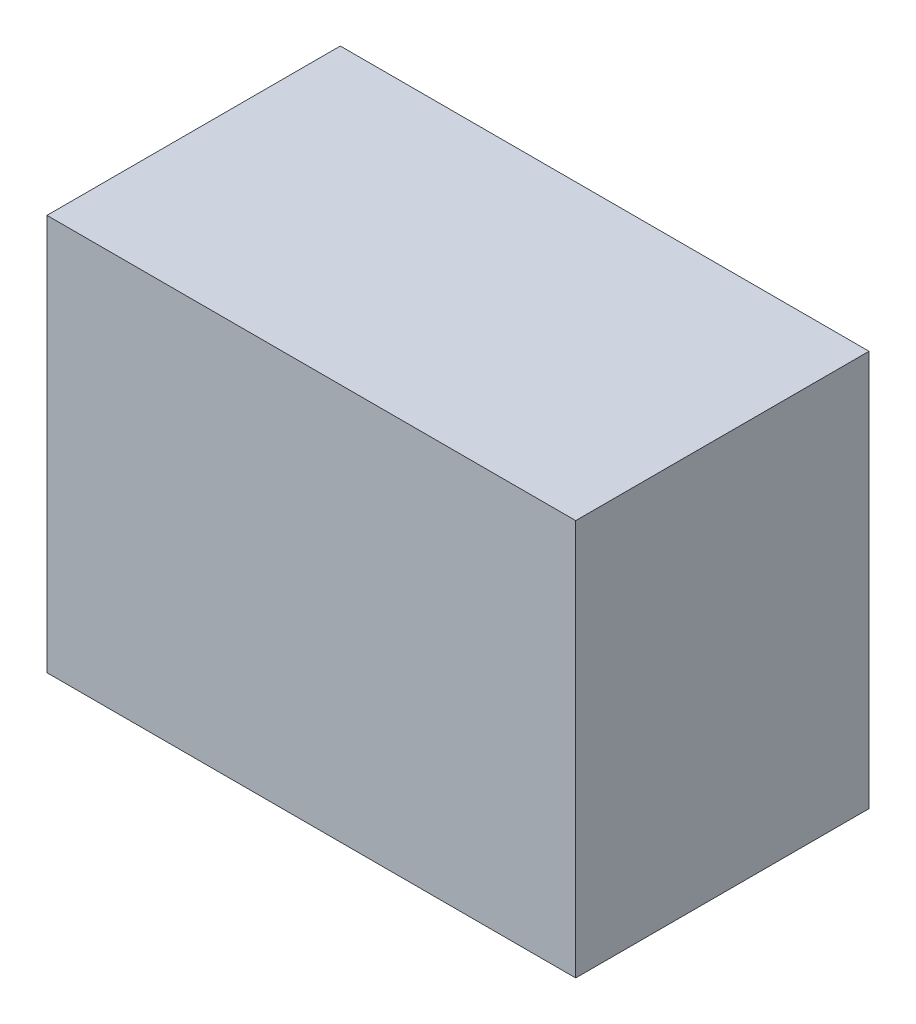
ISO-10303-21;
HEADER;
FILE_DESCRIPTION(('STEP AP214'),'2;1');
FILE_NAME('part.step','',(''),(''),'','','');
FILE_SCHEMA(('AUTOMOTIVE_DESIGN { 1 0 10303 214 1 1 1 1 }'));
ENDSEC;
DATA;
#1=APPLICATION_CONTEXT('core data for automotive mechanical design processes');
#2=APPLICATION_PROTOCOL_DEFINITION('international standard','automotive_design',2000,#1);
#3=PRODUCT_CONTEXT('',#1,'mechanical');
#4=PRODUCT('Part','Part','',(#3));
#5=PRODUCT_RELATED_PRODUCT_CATEGORY('part','',(#4));
#6=PRODUCT_DEFINITION_FORMATION('','',#4);
#7=PRODUCT_DEFINITION_CONTEXT('part definition',#1,'design');
#8=PRODUCT_DEFINITION('design','',#6,#7);
#9=PRODUCT_DEFINITION_SHAPE('','',#8);
#10=(LENGTH_UNIT() NAMED_UNIT(*) SI_UNIT(.MILLI.,.METRE.));
#11=(NAMED_UNIT(*) PLANE_ANGLE_UNIT() SI_UNIT($,.RADIAN.));
#12=(NAMED_UNIT(*) SI_UNIT($,.STERADIAN.) SOLID_ANGLE_UNIT());
#13=UNCERTAINTY_MEASURE_WITH_UNIT(LENGTH_MEASURE(1.E-05),#10,'distance_accuracy_value','');
#14=(GEOMETRIC_REPRESENTATION_CONTEXT(3) GLOBAL_UNCERTAINTY_ASSIGNED_CONTEXT((#13)) GLOBAL_UNIT_ASSIGNED_CONTEXT((#10,
#11,#12)) REPRESENTATION_CONTEXT('',''));
#15=CARTESIAN_POINT('',(0.,0.,0.));
#16=DIRECTION('',(0.,0.,1.));
#17=DIRECTION('',(1.,0.,0.));
#18=AXIS2_PLACEMENT_3D('',#15,#16,#17);
#19=CARTESIAN_POINT('',(-36.7813710524984,30.0638152614732,38.));
#20=DIRECTION('',(1.,0.,0.));
#21=DIRECTION('',(0.,0.,-1.));
#22=AXIS2_PLACEMENT_3D('',#19,#20,#21);
#23=PLANE('',#22);
#24=DIRECTION('',(0.,-1.,0.));
#25=VECTOR('',#24,1.);
#26=CARTESIAN_POINT('',(-36.7813710524984,30.0638152614732,0.));
#27=LINE('',#26,#25);
#28=CARTESIAN_POINT('',(-36.7813710524984,30.0638152614732,0.));
#29=VERTEX_POINT('',#28);
#30=CARTESIAN_POINT('',(-36.7813710524984,-21.2539060273419,0.));
#31=VERTEX_POINT('',#30);
#32=EDGE_CURVE('E105',#29,#31,#27,.T.);
#33=ORIENTED_EDGE('',*,*,#32,.T.);
#34=DIRECTION('',(0.,0.,-1.));
#35=VECTOR('',#34,1.);
#36=CARTESIAN_POINT('',(-36.7813710524984,-21.2539060273419,38.));
#37=LINE('',#36,#35);
#38=CARTESIAN_POINT('',(-36.7813710524984,-21.2539060273419,38.));
#39=VERTEX_POINT('',#38);
#40=EDGE_CURVE('E11',#39,#31,#37,.T.);
#41=ORIENTED_EDGE('',*,*,#40,.F.);
#42=DIRECTION('',(0.,-1.,0.));
#43=VECTOR('',#42,1.);
#44=CARTESIAN_POINT('',(-36.7813710524984,30.0638152614732,38.));
#45=LINE('',#44,#43);
#46=CARTESIAN_POINT('',(-36.7813710524984,30.0638152614732,38.));
#47=VERTEX_POINT('',#46);
#48=EDGE_CURVE('E89',#47,#39,#45,.T.);
#49=ORIENTED_EDGE('',*,*,#48,.F.);
#50=DIRECTION('',(0.,0.,-1.));
#51=VECTOR('',#50,1.);
#52=CARTESIAN_POINT('',(-36.7813710524984,30.0638152614732,38.));
#53=LINE('',#52,#51);
#54=EDGE_CURVE('E97',#47,#29,#53,.T.);
#55=ORIENTED_EDGE('',*,*,#54,.T.);
#56=EDGE_LOOP('',(#33,#41,#49,#55));
#57=FACE_BOUND('',#56,.T.);
#58=ADVANCED_FACE('F39',(#57),#23,.F.);
#59=CARTESIAN_POINT('',(-36.7813710524984,-21.2539060273419,38.));
#60=DIRECTION('',(0.,1.,0.));
#61=DIRECTION('',(0.,0.,1.));
#62=AXIS2_PLACEMENT_3D('',#59,#60,#61);
#63=PLANE('',#62);
#64=DIRECTION('',(1.,0.,0.));
#65=VECTOR('',#64,1.);
#66=CARTESIAN_POINT('',(-36.7813710524984,-21.2539060273419,0.));
#67=LINE('',#66,#65);
#68=CARTESIAN_POINT('',(31.7156732428729,-21.2539060273419,0.));
#69=VERTEX_POINT('',#68);
#70=EDGE_CURVE('E92',#31,#69,#67,.T.);
#71=ORIENTED_EDGE('',*,*,#70,.T.);
#72=DIRECTION('',(0.,0.,-1.));
#73=VECTOR('',#72,1.);
#74=CARTESIAN_POINT('',(31.7156732428729,-21.2539060273419,38.));
#75=LINE('',#74,#73);
#76=CARTESIAN_POINT('',(31.7156732428729,-21.2539060273419,38.));
#77=VERTEX_POINT('',#76);
#78=EDGE_CURVE('E50',#77,#69,#75,.T.);
#79=ORIENTED_EDGE('',*,*,#78,.F.);
#80=DIRECTION('',(1.,0.,0.));
#81=VECTOR('',#80,1.);
#82=CARTESIAN_POINT('',(-36.7813710524984,-21.2539060273419,38.));
#83=LINE('',#82,#81);
#84=EDGE_CURVE('E82',#39,#77,#83,.T.);
#85=ORIENTED_EDGE('',*,*,#84,.F.);
#86=ORIENTED_EDGE('',*,*,#40,.T.);
#87=EDGE_LOOP('',(#71,#79,#85,#86));
#88=FACE_BOUND('',#87,.T.);
#89=ADVANCED_FACE('F93',(#88),#63,.F.);
#90=CARTESIAN_POINT('',(31.7156732428729,30.0638152614732,38.));
#91=DIRECTION('',(-1.,0.,0.));
#92=DIRECTION('',(0.,0.,1.));
#93=AXIS2_PLACEMENT_3D('',#90,#91,#92);
#94=PLANE('',#93);
#95=DIRECTION('',(0.,1.,0.));
#96=VECTOR('',#95,1.);
#97=CARTESIAN_POINT('',(31.7156732428729,30.0638152614732,0.));
#98=LINE('',#97,#96);
#99=CARTESIAN_POINT('',(31.7156732428729,30.0638152614732,0.));
#100=VERTEX_POINT('',#99);
#101=EDGE_CURVE('E72',#69,#100,#98,.T.);
#102=ORIENTED_EDGE('',*,*,#101,.T.);
#103=DIRECTION('',(0.,0.,-1.));
#104=VECTOR('',#103,1.);
#105=CARTESIAN_POINT('',(31.7156732428729,30.0638152614732,38.));
#106=LINE('',#105,#104);
#107=CARTESIAN_POINT('',(31.7156732428729,30.0638152614732,38.));
#108=VERTEX_POINT('',#107);
#109=EDGE_CURVE('E94',#108,#100,#106,.T.);
#110=ORIENTED_EDGE('',*,*,#109,.F.);
#111=DIRECTION('',(0.,1.,0.));
#112=VECTOR('',#111,1.);
#113=CARTESIAN_POINT('',(31.7156732428729,30.0638152614732,38.));
#114=LINE('',#113,#112);
#115=EDGE_CURVE('E88',#77,#108,#114,.T.);
#116=ORIENTED_EDGE('',*,*,#115,.F.);
#117=ORIENTED_EDGE('',*,*,#78,.T.);
#118=EDGE_LOOP('',(#102,#110,#116,#117));
#119=FACE_BOUND('',#118,.T.);
#120=ADVANCED_FACE('F96',(#119),#94,.F.);
#121=CARTESIAN_POINT('',(-36.7813710524984,30.0638152614732,38.));
#122=DIRECTION('',(0.,-1.,0.));
#123=DIRECTION('',(0.,0.,-1.));
#124=AXIS2_PLACEMENT_3D('',#121,#122,#123);
#125=PLANE('',#124);
#126=DIRECTION('',(-1.,0.,0.));
#127=VECTOR('',#126,1.);
#128=CARTESIAN_POINT('',(-36.7813710524984,30.0638152614732,0.));
#129=LINE('',#128,#127);
#130=EDGE_CURVE('E76',#100,#29,#129,.T.);
#131=ORIENTED_EDGE('',*,*,#130,.T.);
#132=ORIENTED_EDGE('',*,*,#54,.F.);
#133=DIRECTION('',(-1.,0.,0.));
#134=VECTOR('',#133,1.);
#135=CARTESIAN_POINT('',(-36.7813710524984,30.0638152614732,38.));
#136=LINE('',#135,#134);
#137=EDGE_CURVE('E54',#108,#47,#136,.T.);
#138=ORIENTED_EDGE('',*,*,#137,.F.);
#139=ORIENTED_EDGE('',*,*,#109,.T.);
#140=EDGE_LOOP('',(#131,#132,#138,#139));
#141=FACE_BOUND('',#140,.T.);
#142=ADVANCED_FACE('F108',(#141),#125,.F.);
#143=CARTESIAN_POINT('',(0.,0.,38.));
#144=DIRECTION('',(0.,0.,1.));
#145=DIRECTION('',(1.,0.,0.));
#146=AXIS2_PLACEMENT_3D('',#143,#144,#145);
#147=PLANE('',#146);
#148=ORIENTED_EDGE('',*,*,#48,.T.);
#149=ORIENTED_EDGE('',*,*,#84,.T.);
#150=ORIENTED_EDGE('',*,*,#115,.T.);
#151=ORIENTED_EDGE('',*,*,#137,.T.);
#152=EDGE_LOOP('',(#148,#149,#150,#151));
#153=FACE_BOUND('',#152,.T.);
#154=ADVANCED_FACE('F86',(#153),#147,.T.);
#155=CARTESIAN_POINT('',(0.,0.,0.));
#156=DIRECTION('',(0.,0.,1.));
#157=DIRECTION('',(1.,0.,0.));
#158=AXIS2_PLACEMENT_3D('',#155,#156,#157);
#159=PLANE('',#158);
#160=ORIENTED_EDGE('',*,*,#32,.F.);
#161=ORIENTED_EDGE('',*,*,#130,.F.);
#162=ORIENTED_EDGE('',*,*,#101,.F.);
#163=ORIENTED_EDGE('',*,*,#70,.F.);
#164=EDGE_LOOP('',(#160,#161,#162,#163));
#165=FACE_BOUND('',#164,.T.);
#166=ADVANCED_FACE('F115',(#165),#159,.F.);
#167=CLOSED_SHELL('',(#58,#89,#120,#142,#154,#166));
#168=MANIFOLD_SOLID_BREP('B2',#167);
#169=ADVANCED_BREP_SHAPE_REPRESENTATION('',(#18,#168),#14);
#170=SHAPE_DEFINITION_REPRESENTATION(#9,#169);
ENDSEC;
END-ISO-10303-21;
